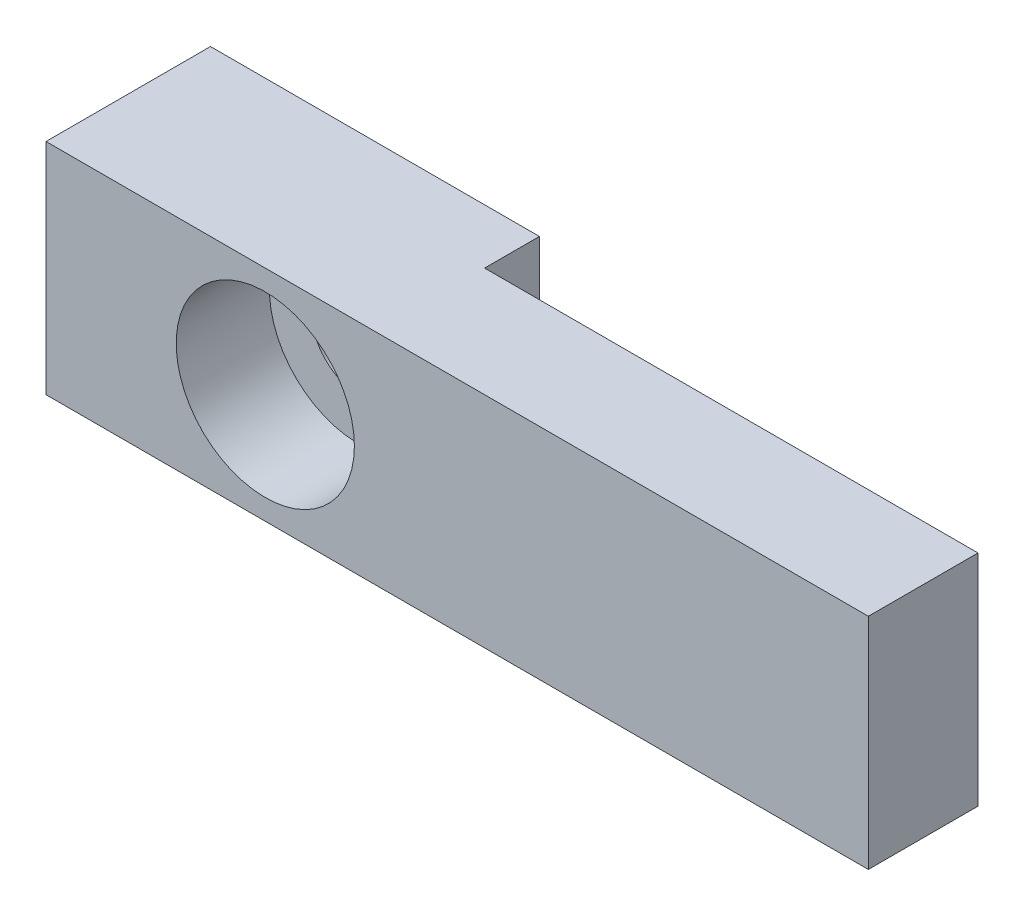
ISO-10303-21;
HEADER;
FILE_DESCRIPTION(('STEP AP214'),'2;1');
FILE_NAME('part.step','',(''),(''),'','','');
FILE_SCHEMA(('AUTOMOTIVE_DESIGN { 1 0 10303 214 1 1 1 1 }'));
ENDSEC;
DATA;
#1=APPLICATION_CONTEXT('core data for automotive mechanical design processes');
#2=APPLICATION_PROTOCOL_DEFINITION('international standard','automotive_design',2000,#1);
#3=PRODUCT_CONTEXT('',#1,'mechanical');
#4=PRODUCT('Part','Part','',(#3));
#5=PRODUCT_RELATED_PRODUCT_CATEGORY('part','',(#4));
#6=PRODUCT_DEFINITION_FORMATION('','',#4);
#7=PRODUCT_DEFINITION_CONTEXT('part definition',#1,'design');
#8=PRODUCT_DEFINITION('design','',#6,#7);
#9=PRODUCT_DEFINITION_SHAPE('','',#8);
#10=(LENGTH_UNIT() NAMED_UNIT(*) SI_UNIT(.MILLI.,.METRE.));
#11=(NAMED_UNIT(*) PLANE_ANGLE_UNIT() SI_UNIT($,.RADIAN.));
#12=(NAMED_UNIT(*) SI_UNIT($,.STERADIAN.) SOLID_ANGLE_UNIT());
#13=UNCERTAINTY_MEASURE_WITH_UNIT(LENGTH_MEASURE(1.E-05),#10,'distance_accuracy_value','');
#14=(GEOMETRIC_REPRESENTATION_CONTEXT(3) GLOBAL_UNCERTAINTY_ASSIGNED_CONTEXT((#13)) GLOBAL_UNIT_ASSIGNED_CONTEXT((#10,
#11,#12)) REPRESENTATION_CONTEXT('',''));
#15=CARTESIAN_POINT('',(0.,0.,0.));
#16=DIRECTION('',(0.,0.,1.));
#17=DIRECTION('',(1.,0.,0.));
#18=AXIS2_PLACEMENT_3D('',#15,#16,#17);
#19=CARTESIAN_POINT('',(8.,0.,6.));
#20=DIRECTION('',(0.,0.,1.));
#21=DIRECTION('',(1.,0.,0.));
#22=AXIS2_PLACEMENT_3D('',#19,#20,#21);
#23=CYLINDRICAL_SURFACE('',#22,1.7);
#24=CARTESIAN_POINT('',(8.,0.,0.));
#25=DIRECTION('',(0.,0.,1.));
#26=DIRECTION('',(1.,0.,0.));
#27=AXIS2_PLACEMENT_3D('',#24,#25,#26);
#28=CIRCLE('',#27,1.7);
#29=CARTESIAN_POINT('',(9.7,0.,0.));
#30=VERTEX_POINT('',#29);
#31=EDGE_CURVE('E105',#30,#30,#28,.F.);
#32=ORIENTED_EDGE('',*,*,#31,.T.);
#33=EDGE_LOOP('',(#32));
#34=FACE_BOUND('',#33,.T.);
#35=CARTESIAN_POINT('',(8.,0.,2.6));
#36=DIRECTION('',(0.,0.,1.));
#37=DIRECTION('',(1.,0.,0.));
#38=AXIS2_PLACEMENT_3D('',#35,#36,#37);
#39=CIRCLE('',#38,1.7);
#40=CARTESIAN_POINT('',(9.7,0.,2.6));
#41=VERTEX_POINT('',#40);
#42=EDGE_CURVE('E19',#41,#41,#39,.T.);
#43=ORIENTED_EDGE('',*,*,#42,.T.);
#44=EDGE_LOOP('',(#43));
#45=FACE_BOUND('',#44,.T.);
#46=ADVANCED_FACE('F16',(#34,#45),#23,.F.);
#47=CARTESIAN_POINT('',(9.7,0.,2.6));
#48=DIRECTION('',(0.,0.,-1.));
#49=DIRECTION('',(-1.,0.,0.));
#50=AXIS2_PLACEMENT_3D('',#47,#48,#49);
#51=PLANE('',#50);
#52=CARTESIAN_POINT('',(8.,0.,2.6));
#53=DIRECTION('',(0.,0.,1.));
#54=DIRECTION('',(1.,0.,0.));
#55=AXIS2_PLACEMENT_3D('',#52,#53,#54);
#56=CIRCLE('',#55,3.25);
#57=CARTESIAN_POINT('',(11.25,0.,2.6));
#58=VERTEX_POINT('',#57);
#59=EDGE_CURVE('E81',#58,#58,#56,.T.);
#60=ORIENTED_EDGE('',*,*,#59,.T.);
#61=EDGE_LOOP('',(#60));
#62=FACE_BOUND('',#61,.T.);
#63=ORIENTED_EDGE('',*,*,#42,.F.);
#64=EDGE_LOOP('',(#63));
#65=FACE_BOUND('',#64,.T.);
#66=ADVANCED_FACE('F119',(#62,#65),#51,.F.);
#67=CARTESIAN_POINT('',(0.,-4.,0.));
#68=DIRECTION('',(0.,0.,1.));
#69=DIRECTION('',(1.,0.,0.));
#70=AXIS2_PLACEMENT_3D('',#67,#68,#69);
#71=PLANE('',#70);
#72=DIRECTION('',(0.,-1.,0.));
#73=VECTOR('',#72,1.);
#74=CARTESIAN_POINT('',(12.,-3.99999999999998,0.));
#75=LINE('',#74,#73);
#76=CARTESIAN_POINT('',(12.,4.,0.));
#77=VERTEX_POINT('',#76);
#78=CARTESIAN_POINT('',(12.,-3.99999999999999,0.));
#79=VERTEX_POINT('',#78);
#80=EDGE_CURVE('E88',#77,#79,#75,.T.);
#81=ORIENTED_EDGE('',*,*,#80,.T.);
#82=DIRECTION('',(-1.,0.,0.));
#83=VECTOR('',#82,1.);
#84=CARTESIAN_POINT('',(0.,-4.,0.));
#85=LINE('',#84,#83);
#86=CARTESIAN_POINT('',(0.,-4.,0.));
#87=VERTEX_POINT('',#86);
#88=EDGE_CURVE('E84',#79,#87,#85,.T.);
#89=ORIENTED_EDGE('',*,*,#88,.T.);
#90=DIRECTION('',(0.,1.,0.));
#91=VECTOR('',#90,1.);
#92=CARTESIAN_POINT('',(0.,4.,0.));
#93=LINE('',#92,#91);
#94=CARTESIAN_POINT('',(0.,4.,0.));
#95=VERTEX_POINT('',#94);
#96=EDGE_CURVE('E71',#87,#95,#93,.T.);
#97=ORIENTED_EDGE('',*,*,#96,.T.);
#98=DIRECTION('',(1.,0.,0.));
#99=VECTOR('',#98,1.);
#100=CARTESIAN_POINT('',(0.,4.,0.));
#101=LINE('',#100,#99);
#102=EDGE_CURVE('E163',#95,#77,#101,.T.);
#103=ORIENTED_EDGE('',*,*,#102,.T.);
#104=EDGE_LOOP('',(#81,#89,#97,#103));
#105=FACE_BOUND('',#104,.T.);
#106=ORIENTED_EDGE('',*,*,#31,.F.);
#107=EDGE_LOOP('',(#106));
#108=FACE_BOUND('',#107,.T.);
#109=ADVANCED_FACE('F85',(#105,#108),#71,.F.);
#110=CARTESIAN_POINT('',(12.,-3.99999999999998,2.));
#111=DIRECTION('',(-1.,0.,0.));
#112=DIRECTION('',(0.,-1.,0.));
#113=AXIS2_PLACEMENT_3D('',#110,#111,#112);
#114=PLANE('',#113);
#115=DIRECTION('',(0.,0.,-1.));
#116=VECTOR('',#115,1.);
#117=CARTESIAN_POINT('',(12.,4.,6.));
#118=LINE('',#117,#116);
#119=CARTESIAN_POINT('',(12.,4.,2.));
#120=VERTEX_POINT('',#119);
#121=EDGE_CURVE('E161',#77,#120,#118,.F.);
#122=ORIENTED_EDGE('',*,*,#121,.T.);
#123=DIRECTION('',(0.,1.,0.));
#124=VECTOR('',#123,1.);
#125=CARTESIAN_POINT('',(12.,4.,2.));
#126=LINE('',#125,#124);
#127=CARTESIAN_POINT('',(12.,-3.99999999999999,2.));
#128=VERTEX_POINT('',#127);
#129=EDGE_CURVE('E66',#120,#128,#126,.F.);
#130=ORIENTED_EDGE('',*,*,#129,.T.);
#131=DIRECTION('',(0.,0.,1.));
#132=VECTOR('',#131,1.);
#133=CARTESIAN_POINT('',(12.,-3.99999999999999,6.));
#134=LINE('',#133,#132);
#135=EDGE_CURVE('E92',#128,#79,#134,.F.);
#136=ORIENTED_EDGE('',*,*,#135,.T.);
#137=ORIENTED_EDGE('',*,*,#80,.F.);
#138=EDGE_LOOP('',(#122,#130,#136,#137));
#139=FACE_BOUND('',#138,.T.);
#140=ADVANCED_FACE('F127',(#139),#114,.F.);
#141=CARTESIAN_POINT('',(30.,4.,2.));
#142=DIRECTION('',(0.,0.,1.));
#143=DIRECTION('',(1.,0.,0.));
#144=AXIS2_PLACEMENT_3D('',#141,#142,#143);
#145=PLANE('',#144);
#146=DIRECTION('',(-1.,0.,0.));
#147=VECTOR('',#146,1.);
#148=CARTESIAN_POINT('',(0.,-4.,2.));
#149=LINE('',#148,#147);
#150=CARTESIAN_POINT('',(30.,-3.99999999999998,2.));
#151=VERTEX_POINT('',#150);
#152=EDGE_CURVE('E98',#151,#128,#149,.T.);
#153=ORIENTED_EDGE('',*,*,#152,.T.);
#154=ORIENTED_EDGE('',*,*,#129,.F.);
#155=DIRECTION('',(1.,0.,0.));
#156=VECTOR('',#155,1.);
#157=CARTESIAN_POINT('',(0.,4.,2.));
#158=LINE('',#157,#156);
#159=CARTESIAN_POINT('',(30.,4.,2.));
#160=VERTEX_POINT('',#159);
#161=EDGE_CURVE('E110',#120,#160,#158,.T.);
#162=ORIENTED_EDGE('',*,*,#161,.T.);
#163=DIRECTION('',(0.,-1.,0.));
#164=VECTOR('',#163,1.);
#165=CARTESIAN_POINT('',(30.,4.,2.));
#166=LINE('',#165,#164);
#167=EDGE_CURVE('E91',#160,#151,#166,.T.);
#168=ORIENTED_EDGE('',*,*,#167,.T.);
#169=EDGE_LOOP('',(#153,#154,#162,#168));
#170=FACE_BOUND('',#169,.T.);
#171=ADVANCED_FACE('F152',(#170),#145,.F.);
#172=CARTESIAN_POINT('',(8.,0.,6.));
#173=DIRECTION('',(0.,0.,1.));
#174=DIRECTION('',(1.,0.,0.));
#175=AXIS2_PLACEMENT_3D('',#172,#173,#174);
#176=CYLINDRICAL_SURFACE('',#175,3.25);
#177=CARTESIAN_POINT('',(8.,0.,6.));
#178=DIRECTION('',(0.,0.,1.));
#179=DIRECTION('',(1.,0.,0.));
#180=AXIS2_PLACEMENT_3D('',#177,#178,#179);
#181=CIRCLE('',#180,3.25);
#182=CARTESIAN_POINT('',(11.25,0.,6.));
#183=VERTEX_POINT('',#182);
#184=EDGE_CURVE('E106',#183,#183,#181,.F.);
#185=ORIENTED_EDGE('',*,*,#184,.F.);
#186=EDGE_LOOP('',(#185));
#187=FACE_BOUND('',#186,.T.);
#188=ORIENTED_EDGE('',*,*,#59,.F.);
#189=EDGE_LOOP('',(#188));
#190=FACE_BOUND('',#189,.T.);
#191=ADVANCED_FACE('F149',(#187,#190),#176,.F.);
#192=CARTESIAN_POINT('',(0.,4.,6.));
#193=DIRECTION('',(1.,0.,0.));
#194=DIRECTION('',(0.,1.,0.));
#195=AXIS2_PLACEMENT_3D('',#192,#193,#194);
#196=PLANE('',#195);
#197=DIRECTION('',(0.,0.,1.));
#198=VECTOR('',#197,1.);
#199=CARTESIAN_POINT('',(0.,-4.,6.));
#200=LINE('',#199,#198);
#201=CARTESIAN_POINT('',(0.,-4.,6.));
#202=VERTEX_POINT('',#201);
#203=EDGE_CURVE('E75',#87,#202,#200,.T.);
#204=ORIENTED_EDGE('',*,*,#203,.T.);
#205=DIRECTION('',(0.,1.,0.));
#206=VECTOR('',#205,1.);
#207=CARTESIAN_POINT('',(0.,-4.,6.));
#208=LINE('',#207,#206);
#209=CARTESIAN_POINT('',(0.,4.,6.));
#210=VERTEX_POINT('',#209);
#211=EDGE_CURVE('E109',#210,#202,#208,.F.);
#212=ORIENTED_EDGE('',*,*,#211,.F.);
#213=DIRECTION('',(0.,0.,-1.));
#214=VECTOR('',#213,1.);
#215=CARTESIAN_POINT('',(0.,4.,6.));
#216=LINE('',#215,#214);
#217=EDGE_CURVE('E78',#210,#95,#216,.T.);
#218=ORIENTED_EDGE('',*,*,#217,.T.);
#219=ORIENTED_EDGE('',*,*,#96,.F.);
#220=EDGE_LOOP('',(#204,#212,#218,#219));
#221=FACE_BOUND('',#220,.T.);
#222=ADVANCED_FACE('F73',(#221),#196,.F.);
#223=CARTESIAN_POINT('',(0.,-4.,6.));
#224=DIRECTION('',(0.,1.,0.));
#225=DIRECTION('',(-1.,0.,0.));
#226=AXIS2_PLACEMENT_3D('',#223,#224,#225);
#227=PLANE('',#226);
#228=ORIENTED_EDGE('',*,*,#135,.F.);
#229=ORIENTED_EDGE('',*,*,#152,.F.);
#230=DIRECTION('',(0.,0.,1.));
#231=VECTOR('',#230,1.);
#232=CARTESIAN_POINT('',(30.,-3.99999999999998,6.));
#233=LINE('',#232,#231);
#234=CARTESIAN_POINT('',(30.,-3.99999999999999,6.));
#235=VERTEX_POINT('',#234);
#236=EDGE_CURVE('E174',#151,#235,#233,.T.);
#237=ORIENTED_EDGE('',*,*,#236,.T.);
#238=DIRECTION('',(1.,0.,0.));
#239=VECTOR('',#238,1.);
#240=CARTESIAN_POINT('',(0.,-4.,6.));
#241=LINE('',#240,#239);
#242=EDGE_CURVE('E96',#202,#235,#241,.T.);
#243=ORIENTED_EDGE('',*,*,#242,.F.);
#244=ORIENTED_EDGE('',*,*,#203,.F.);
#245=ORIENTED_EDGE('',*,*,#88,.F.);
#246=EDGE_LOOP('',(#228,#229,#237,#243,#244,#245));
#247=FACE_BOUND('',#246,.T.);
#248=ADVANCED_FACE('F94',(#247),#227,.F.);
#249=CARTESIAN_POINT('',(30.,4.,6.));
#250=DIRECTION('',(-1.,0.,0.));
#251=DIRECTION('',(0.,-1.,0.));
#252=AXIS2_PLACEMENT_3D('',#249,#250,#251);
#253=PLANE('',#252);
#254=ORIENTED_EDGE('',*,*,#167,.F.);
#255=DIRECTION('',(0.,0.,-1.));
#256=VECTOR('',#255,1.);
#257=CARTESIAN_POINT('',(30.,4.,6.));
#258=LINE('',#257,#256);
#259=CARTESIAN_POINT('',(30.,4.,6.));
#260=VERTEX_POINT('',#259);
#261=EDGE_CURVE('E34',#160,#260,#258,.F.);
#262=ORIENTED_EDGE('',*,*,#261,.T.);
#263=DIRECTION('',(0.,1.,0.));
#264=VECTOR('',#263,1.);
#265=CARTESIAN_POINT('',(30.,-4.,6.));
#266=LINE('',#265,#264);
#267=EDGE_CURVE('E25',#235,#260,#266,.T.);
#268=ORIENTED_EDGE('',*,*,#267,.F.);
#269=ORIENTED_EDGE('',*,*,#236,.F.);
#270=EDGE_LOOP('',(#254,#262,#268,#269));
#271=FACE_BOUND('',#270,.T.);
#272=ADVANCED_FACE('F137',(#271),#253,.F.);
#273=CARTESIAN_POINT('',(0.,4.,6.));
#274=DIRECTION('',(0.,-1.,0.));
#275=DIRECTION('',(0.,0.,-1.));
#276=AXIS2_PLACEMENT_3D('',#273,#274,#275);
#277=PLANE('',#276);
#278=ORIENTED_EDGE('',*,*,#121,.F.);
#279=ORIENTED_EDGE('',*,*,#102,.F.);
#280=ORIENTED_EDGE('',*,*,#217,.F.);
#281=DIRECTION('',(1.,0.,0.));
#282=VECTOR('',#281,1.);
#283=CARTESIAN_POINT('',(0.,4.,6.));
#284=LINE('',#283,#282);
#285=EDGE_CURVE('E11',#260,#210,#284,.F.);
#286=ORIENTED_EDGE('',*,*,#285,.F.);
#287=ORIENTED_EDGE('',*,*,#261,.F.);
#288=ORIENTED_EDGE('',*,*,#161,.F.);
#289=EDGE_LOOP('',(#278,#279,#280,#286,#287,#288));
#290=FACE_BOUND('',#289,.T.);
#291=ADVANCED_FACE('F131',(#290),#277,.F.);
#292=CARTESIAN_POINT('',(0.,-4.,6.));
#293=DIRECTION('',(0.,0.,1.));
#294=DIRECTION('',(1.,0.,0.));
#295=AXIS2_PLACEMENT_3D('',#292,#293,#294);
#296=PLANE('',#295);
#297=ORIENTED_EDGE('',*,*,#267,.T.);
#298=ORIENTED_EDGE('',*,*,#285,.T.);
#299=ORIENTED_EDGE('',*,*,#211,.T.);
#300=ORIENTED_EDGE('',*,*,#242,.T.);
#301=EDGE_LOOP('',(#297,#298,#299,#300));
#302=FACE_BOUND('',#301,.T.);
#303=ORIENTED_EDGE('',*,*,#184,.T.);
#304=EDGE_LOOP('',(#303));
#305=FACE_BOUND('',#304,.T.);
#306=ADVANCED_FACE('F129',(#302,#305),#296,.T.);
#307=CLOSED_SHELL('',(#46,#66,#109,#140,#171,#191,#222,#248,#272,#291,#306));
#308=MANIFOLD_SOLID_BREP('B1',#307);
#309=ADVANCED_BREP_SHAPE_REPRESENTATION('',(#18,#308),#14);
#310=SHAPE_DEFINITION_REPRESENTATION(#9,#309);
ENDSEC;
END-ISO-10303-21;
